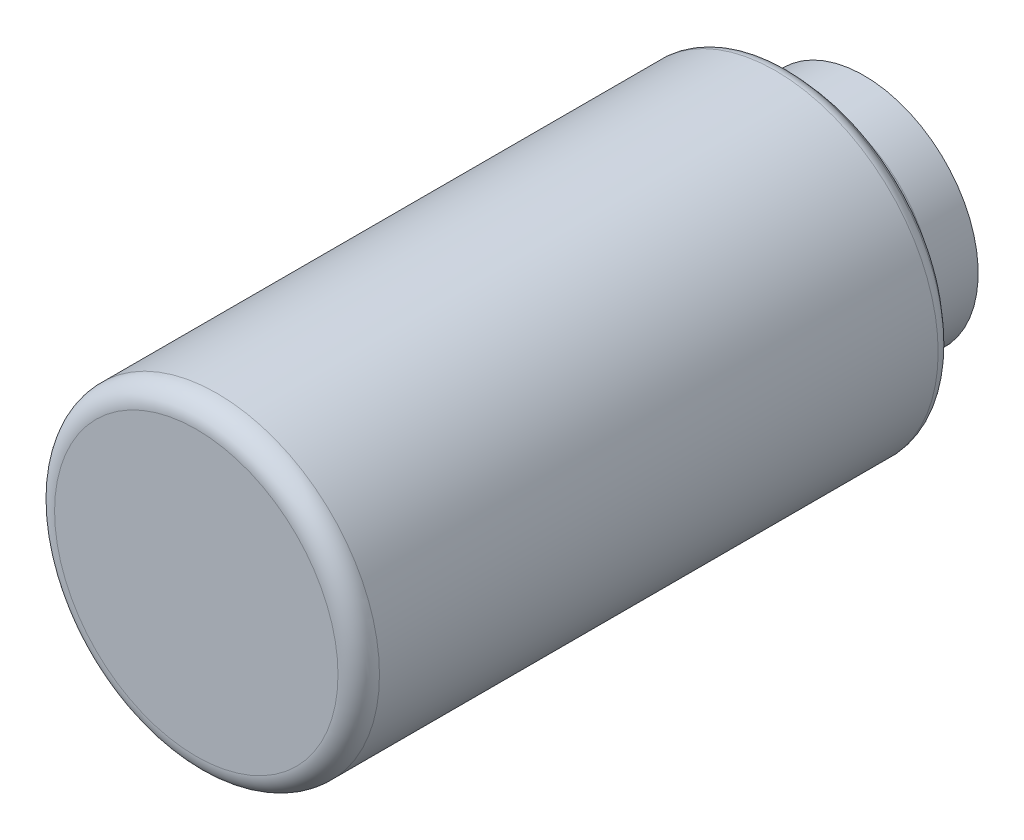
ISO-10303-21;
HEADER;
FILE_DESCRIPTION(('STEP AP214'),'2;1');
FILE_NAME('part.step','',(''),(''),'','','');
FILE_SCHEMA(('AUTOMOTIVE_DESIGN { 1 0 10303 214 1 1 1 1 }'));
ENDSEC;
DATA;
#1=APPLICATION_CONTEXT('core data for automotive mechanical design processes');
#2=APPLICATION_PROTOCOL_DEFINITION('international standard','automotive_design',2000,#1);
#3=PRODUCT_CONTEXT('',#1,'mechanical');
#4=PRODUCT('Part','Part','',(#3));
#5=PRODUCT_RELATED_PRODUCT_CATEGORY('part','',(#4));
#6=PRODUCT_DEFINITION_FORMATION('','',#4);
#7=PRODUCT_DEFINITION_CONTEXT('part definition',#1,'design');
#8=PRODUCT_DEFINITION('design','',#6,#7);
#9=PRODUCT_DEFINITION_SHAPE('','',#8);
#10=(LENGTH_UNIT() NAMED_UNIT(*) SI_UNIT(.MILLI.,.METRE.));
#11=(NAMED_UNIT(*) PLANE_ANGLE_UNIT() SI_UNIT($,.RADIAN.));
#12=(NAMED_UNIT(*) SI_UNIT($,.STERADIAN.) SOLID_ANGLE_UNIT());
#13=UNCERTAINTY_MEASURE_WITH_UNIT(LENGTH_MEASURE(1.E-05),#10,'distance_accuracy_value','');
#14=(GEOMETRIC_REPRESENTATION_CONTEXT(3) GLOBAL_UNCERTAINTY_ASSIGNED_CONTEXT((#13)) GLOBAL_UNIT_ASSIGNED_CONTEXT((#10,
#11,#12)) REPRESENTATION_CONTEXT('',''));
#15=CARTESIAN_POINT('',(0.,0.,0.));
#16=DIRECTION('',(0.,0.,1.));
#17=DIRECTION('',(1.,0.,0.));
#18=AXIS2_PLACEMENT_3D('',#15,#16,#17);
#19=CARTESIAN_POINT('',(23.5,0.,-90.1688601931525));
#20=DIRECTION('',(0.,0.,-1.));
#21=DIRECTION('',(-1.,0.,0.));
#22=AXIS2_PLACEMENT_3D('',#19,#20,#21);
#23=TOROIDAL_SURFACE('',#22,18.51,2.);
#24=CARTESIAN_POINT('',(23.5,0.,-88.2574032194663));
#25=DIRECTION('',(0.,0.,1.));
#26=DIRECTION('',(1.,0.,0.));
#27=AXIS2_PLACEMENT_3D('',#24,#25,#26);
#28=CIRCLE('',#27,17.9215000104108);
#29=CARTESIAN_POINT('',(41.4215000104107,0.,-88.2574032194663));
#30=VERTEX_POINT('',#29);
#31=EDGE_CURVE('E86',#30,#30,#28,.T.);
#32=ORIENTED_EDGE('',*,*,#31,.F.);
#33=EDGE_LOOP('',(#32));
#34=FACE_BOUND('',#33,.T.);
#35=CARTESIAN_POINT('',(23.5,0.,-90.1688601931525));
#36=DIRECTION('',(0.,0.,-1.));
#37=DIRECTION('',(-1.,0.,0.));
#38=AXIS2_PLACEMENT_3D('',#35,#36,#37);
#39=CIRCLE('',#38,16.51);
#40=CARTESIAN_POINT('',(6.99,0.,-90.1688601931525));
#41=VERTEX_POINT('',#40);
#42=EDGE_CURVE('E99',#41,#41,#39,.T.);
#43=ORIENTED_EDGE('',*,*,#42,.F.);
#44=EDGE_LOOP('',(#43));
#45=FACE_BOUND('',#44,.T.);
#46=ADVANCED_FACE('F17',(#34,#45),#23,.F.);
#47=CARTESIAN_POINT('',(23.5,0.,-3.));
#48=DIRECTION('',(0.,0.,-1.));
#49=DIRECTION('',(-1.,0.,0.));
#50=AXIS2_PLACEMENT_3D('',#47,#48,#49);
#51=TOROIDAL_SURFACE('',#50,20.5,1.);
#52=CARTESIAN_POINT('',(23.5,0.,-2.));
#53=DIRECTION('',(0.,0.,1.));
#54=DIRECTION('',(-1.,0.,0.));
#55=AXIS2_PLACEMENT_3D('',#52,#53,#54);
#56=CIRCLE('',#55,20.5);
#57=CARTESIAN_POINT('',(3.,0.,-2.));
#58=VERTEX_POINT('',#57);
#59=EDGE_CURVE('E21',#58,#58,#56,.T.);
#60=ORIENTED_EDGE('',*,*,#59,.T.);
#61=EDGE_LOOP('',(#60));
#62=FACE_BOUND('',#61,.T.);
#63=CARTESIAN_POINT('',(23.5,0.,-3.));
#64=DIRECTION('',(0.,0.,-1.));
#65=DIRECTION('',(-1.,0.,0.));
#66=AXIS2_PLACEMENT_3D('',#63,#64,#65);
#67=CIRCLE('',#66,21.5);
#68=CARTESIAN_POINT('',(1.99999999999997,0.,-3.));
#69=VERTEX_POINT('',#68);
#70=EDGE_CURVE('E11',#69,#69,#67,.T.);
#71=ORIENTED_EDGE('',*,*,#70,.T.);
#72=EDGE_LOOP('',(#71));
#73=FACE_BOUND('',#72,.T.);
#74=ADVANCED_FACE('F147',(#62,#73),#51,.F.);
#75=CARTESIAN_POINT('',(23.5,0.,-96.6));
#76=DIRECTION('',(0.,0.,-1.));
#77=DIRECTION('',(-1.,0.,0.));
#78=AXIS2_PLACEMENT_3D('',#75,#76,#77);
#79=CYLINDRICAL_SURFACE('',#78,21.5);
#80=ORIENTED_EDGE('',*,*,#70,.F.);
#81=EDGE_LOOP('',(#80));
#82=FACE_BOUND('',#81,.T.);
#83=CARTESIAN_POINT('',(23.5,0.,-83.8210870460794));
#84=DIRECTION('',(0.,0.,-1.));
#85=DIRECTION('',(1.,0.,0.));
#86=AXIS2_PLACEMENT_3D('',#83,#84,#85);
#87=CIRCLE('',#86,21.5);
#88=CARTESIAN_POINT('',(45.,0.,-83.8210870460794));
#89=VERTEX_POINT('',#88);
#90=EDGE_CURVE('E104',#89,#89,#87,.T.);
#91=ORIENTED_EDGE('',*,*,#90,.T.);
#92=EDGE_LOOP('',(#91));
#93=FACE_BOUND('',#92,.T.);
#94=ADVANCED_FACE('F153',(#82,#93),#79,.F.);
#95=CARTESIAN_POINT('',(0.,0.,-2.));
#96=DIRECTION('',(0.,0.,-1.));
#97=DIRECTION('',(-1.,0.,0.));
#98=AXIS2_PLACEMENT_3D('',#95,#96,#97);
#99=PLANE('',#98);
#100=ORIENTED_EDGE('',*,*,#59,.F.);
#101=EDGE_LOOP('',(#100));
#102=FACE_BOUND('',#101,.T.);
#103=ADVANCED_FACE('F19',(#102),#99,.T.);
#104=CARTESIAN_POINT('',(23.5,0.,-96.6));
#105=DIRECTION('',(0.,0.,-1.));
#106=DIRECTION('',(-1.,0.,0.));
#107=AXIS2_PLACEMENT_3D('',#104,#105,#106);
#108=CYLINDRICAL_SURFACE('',#107,14.51);
#109=CARTESIAN_POINT('',(23.5,0.,-86.7879473402278));
#110=DIRECTION('',(0.,0.,-1.));
#111=DIRECTION('',(1.,0.,0.));
#112=AXIS2_PLACEMENT_3D('',#109,#110,#111);
#113=CIRCLE('',#112,14.51);
#114=CARTESIAN_POINT('',(38.01,0.,-86.7879473402278));
#115=VERTEX_POINT('',#114);
#116=EDGE_CURVE('E107',#115,#115,#113,.T.);
#117=ORIENTED_EDGE('',*,*,#116,.F.);
#118=EDGE_LOOP('',(#117));
#119=FACE_BOUND('',#118,.T.);
#120=CARTESIAN_POINT('',(23.5,0.,-96.6));
#121=DIRECTION('',(0.,0.,-1.));
#122=DIRECTION('',(-1.,0.,0.));
#123=AXIS2_PLACEMENT_3D('',#120,#121,#122);
#124=CIRCLE('',#123,14.51);
#125=CARTESIAN_POINT('',(8.99,0.,-96.6));
#126=VERTEX_POINT('',#125);
#127=EDGE_CURVE('E95',#126,#126,#124,.T.);
#128=ORIENTED_EDGE('',*,*,#127,.T.);
#129=EDGE_LOOP('',(#128));
#130=FACE_BOUND('',#129,.T.);
#131=ADVANCED_FACE('F122',(#119,#130),#108,.F.);
#132=CARTESIAN_POINT('',(23.5,0.,-76.7886613773494));
#133=DIRECTION('',(0.,0.,-1.));
#134=DIRECTION('',(-1.,0.,0.));
#135=AXIS2_PLACEMENT_3D('',#132,#133,#134);
#136=TOROIDAL_SURFACE('',#135,14.3905000728752,10.);
#137=ORIENTED_EDGE('',*,*,#90,.F.);
#138=EDGE_LOOP('',(#137));
#139=FACE_BOUND('',#138,.T.);
#140=ORIENTED_EDGE('',*,*,#116,.T.);
#141=EDGE_LOOP('',(#140));
#142=FACE_BOUND('',#141,.T.);
#143=ADVANCED_FACE('F120',(#139,#142),#136,.F.);
#144=CARTESIAN_POINT('',(23.5,0.,-3.));
#145=DIRECTION('',(0.,0.,-1.));
#146=DIRECTION('',(-1.,0.,0.));
#147=AXIS2_PLACEMENT_3D('',#144,#145,#146);
#148=TOROIDAL_SURFACE('',#147,20.5,3.);
#149=CARTESIAN_POINT('',(23.5,0.,0.));
#150=DIRECTION('',(0.,0.,1.));
#151=DIRECTION('',(-1.,0.,0.));
#152=AXIS2_PLACEMENT_3D('',#149,#150,#151);
#153=CIRCLE('',#152,20.5);
#154=CARTESIAN_POINT('',(3.,0.,0.));
#155=VERTEX_POINT('',#154);
#156=EDGE_CURVE('E98',#155,#155,#153,.T.);
#157=ORIENTED_EDGE('',*,*,#156,.F.);
#158=EDGE_LOOP('',(#157));
#159=FACE_BOUND('',#158,.T.);
#160=CARTESIAN_POINT('',(23.5,0.,-3.));
#161=DIRECTION('',(0.,0.,-1.));
#162=DIRECTION('',(-1.,0.,0.));
#163=AXIS2_PLACEMENT_3D('',#160,#161,#162);
#164=CIRCLE('',#163,23.5);
#165=CARTESIAN_POINT('',(0.,0.,-3.));
#166=VERTEX_POINT('',#165);
#167=EDGE_CURVE('E111',#166,#166,#164,.T.);
#168=ORIENTED_EDGE('',*,*,#167,.F.);
#169=EDGE_LOOP('',(#168));
#170=FACE_BOUND('',#169,.T.);
#171=ADVANCED_FACE('F171',(#159,#170),#148,.T.);
#172=CARTESIAN_POINT('',(23.5,0.,-83.8210870460795));
#173=DIRECTION('',(0.,0.,1.));
#174=DIRECTION('',(1.,0.,0.));
#175=AXIS2_PLACEMENT_3D('',#172,#173,#174);
#176=TOROIDAL_SURFACE('',#175,21.5,2.);
#177=CARTESIAN_POINT('',(23.5,0.,-83.8210870460795));
#178=DIRECTION('',(0.,0.,1.));
#179=DIRECTION('',(1.,0.,0.));
#180=AXIS2_PLACEMENT_3D('',#177,#178,#179);
#181=CIRCLE('',#180,23.5);
#182=CARTESIAN_POINT('',(47.,0.,-83.8210870460795));
#183=VERTEX_POINT('',#182);
#184=EDGE_CURVE('E110',#183,#183,#181,.T.);
#185=ORIENTED_EDGE('',*,*,#184,.F.);
#186=EDGE_LOOP('',(#185));
#187=FACE_BOUND('',#186,.T.);
#188=CARTESIAN_POINT('',(23.5,0.,-85.2275721798255));
#189=DIRECTION('',(0.,0.,-1.));
#190=DIRECTION('',(1.,0.,0.));
#191=AXIS2_PLACEMENT_3D('',#188,#189,#190);
#192=CIRCLE('',#191,22.9218999854249);
#193=CARTESIAN_POINT('',(46.4218999854249,0.,-85.2275721798255));
#194=VERTEX_POINT('',#193);
#195=EDGE_CURVE('E82',#194,#194,#192,.T.);
#196=ORIENTED_EDGE('',*,*,#195,.F.);
#197=EDGE_LOOP('',(#196));
#198=FACE_BOUND('',#197,.T.);
#199=ADVANCED_FACE('F168',(#187,#198),#176,.T.);
#200=CARTESIAN_POINT('',(23.5,0.,-96.6));
#201=DIRECTION('',(0.,0.,-1.));
#202=DIRECTION('',(-1.,0.,0.));
#203=AXIS2_PLACEMENT_3D('',#200,#201,#202);
#204=CYLINDRICAL_SURFACE('',#203,23.5);
#205=ORIENTED_EDGE('',*,*,#167,.T.);
#206=EDGE_LOOP('',(#205));
#207=FACE_BOUND('',#206,.T.);
#208=ORIENTED_EDGE('',*,*,#184,.T.);
#209=EDGE_LOOP('',(#208));
#210=FACE_BOUND('',#209,.T.);
#211=ADVANCED_FACE('F167',(#207,#210),#204,.T.);
#212=CARTESIAN_POINT('',(0.,0.,0.));
#213=DIRECTION('',(0.,0.,-1.));
#214=DIRECTION('',(-1.,0.,0.));
#215=AXIS2_PLACEMENT_3D('',#212,#213,#214);
#216=PLANE('',#215);
#217=ORIENTED_EDGE('',*,*,#156,.T.);
#218=EDGE_LOOP('',(#217));
#219=FACE_BOUND('',#218,.T.);
#220=ADVANCED_FACE('F131',(#219),#216,.F.);
#221=CARTESIAN_POINT('',(0.,0.,-96.6));
#222=DIRECTION('',(0.,0.,-1.));
#223=DIRECTION('',(-1.,0.,0.));
#224=AXIS2_PLACEMENT_3D('',#221,#222,#223);
#225=PLANE('',#224);
#226=ORIENTED_EDGE('',*,*,#127,.F.);
#227=EDGE_LOOP('',(#226));
#228=FACE_BOUND('',#227,.T.);
#229=CARTESIAN_POINT('',(23.5,0.,-96.6));
#230=DIRECTION('',(0.,0.,-1.));
#231=DIRECTION('',(-1.,0.,0.));
#232=AXIS2_PLACEMENT_3D('',#229,#230,#231);
#233=CIRCLE('',#232,16.51);
#234=CARTESIAN_POINT('',(6.99,0.,-96.6));
#235=VERTEX_POINT('',#234);
#236=EDGE_CURVE('E92',#235,#235,#233,.T.);
#237=ORIENTED_EDGE('',*,*,#236,.T.);
#238=EDGE_LOOP('',(#237));
#239=FACE_BOUND('',#238,.T.);
#240=ADVANCED_FACE('F127',(#228,#239),#225,.T.);
#241=CARTESIAN_POINT('',(23.5,0.,-96.6));
#242=DIRECTION('',(0.,0.,-1.));
#243=DIRECTION('',(-1.,0.,0.));
#244=AXIS2_PLACEMENT_3D('',#241,#242,#243);
#245=CYLINDRICAL_SURFACE('',#244,16.51);
#246=ORIENTED_EDGE('',*,*,#42,.T.);
#247=EDGE_LOOP('',(#246));
#248=FACE_BOUND('',#247,.T.);
#249=ORIENTED_EDGE('',*,*,#236,.F.);
#250=EDGE_LOOP('',(#249));
#251=FACE_BOUND('',#250,.T.);
#252=ADVANCED_FACE('F130',(#248,#251),#245,.T.);
#253=CARTESIAN_POINT('',(23.5,0.,-76.7886613773494));
#254=DIRECTION('',(0.,0.,-1.));
#255=DIRECTION('',(-1.,0.,0.));
#256=AXIS2_PLACEMENT_3D('',#253,#254,#255);
#257=TOROIDAL_SURFACE('',#256,14.3905000728752,12.);
#258=ORIENTED_EDGE('',*,*,#31,.T.);
#259=EDGE_LOOP('',(#258));
#260=FACE_BOUND('',#259,.T.);
#261=ORIENTED_EDGE('',*,*,#195,.T.);
#262=EDGE_LOOP('',(#261));
#263=FACE_BOUND('',#262,.T.);
#264=ADVANCED_FACE('F83',(#260,#263),#257,.T.);
#265=CLOSED_SHELL('',(#46,#74,#94,#103,#131,#143,#171,#199,#211,#220,#240,#252,#264));
#266=MANIFOLD_SOLID_BREP('B1',#265);
#267=ADVANCED_BREP_SHAPE_REPRESENTATION('',(#18,#266),#14);
#268=SHAPE_DEFINITION_REPRESENTATION(#9,#267);
ENDSEC;
END-ISO-10303-21;
